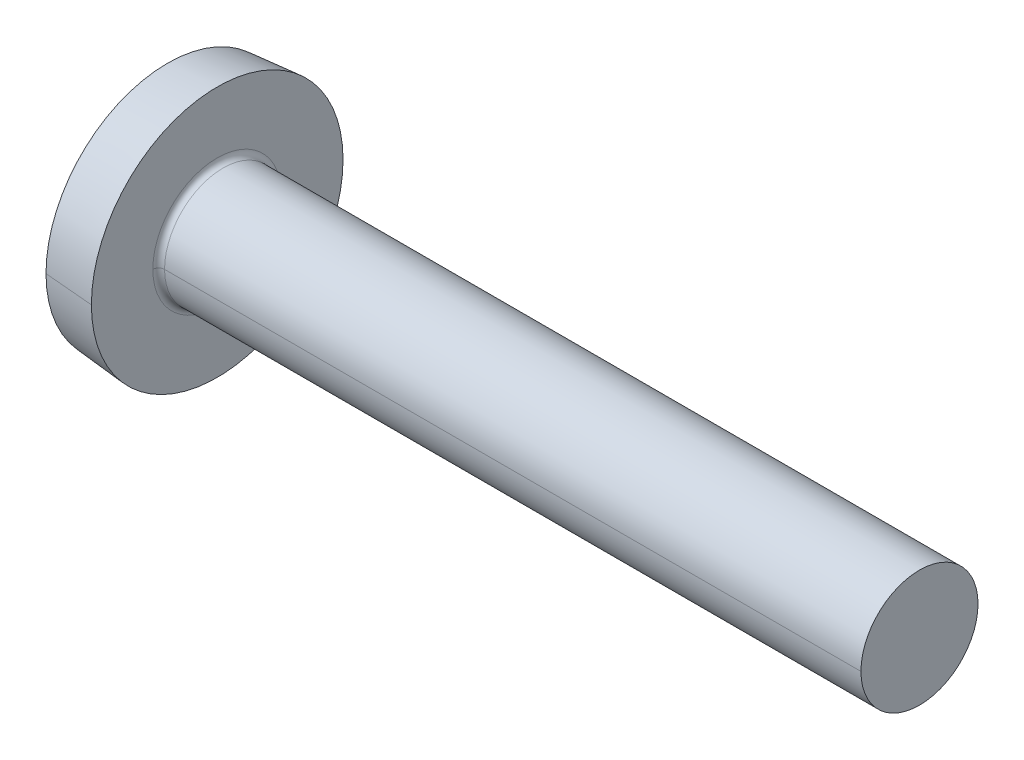
ISO-10303-21;
HEADER;
FILE_DESCRIPTION(('STEP AP214'),'2;1');
FILE_NAME('part.step','',(''),(''),'','','');
FILE_SCHEMA(('AUTOMOTIVE_DESIGN { 1 0 10303 214 1 1 1 1 }'));
ENDSEC;
DATA;
#1=APPLICATION_CONTEXT('core data for automotive mechanical design processes');
#2=APPLICATION_PROTOCOL_DEFINITION('international standard','automotive_design',2000,#1);
#3=PRODUCT_CONTEXT('',#1,'mechanical');
#4=PRODUCT('Part','Part','',(#3));
#5=PRODUCT_RELATED_PRODUCT_CATEGORY('part','',(#4));
#6=PRODUCT_DEFINITION_FORMATION('','',#4);
#7=PRODUCT_DEFINITION_CONTEXT('part definition',#1,'design');
#8=PRODUCT_DEFINITION('design','',#6,#7);
#9=PRODUCT_DEFINITION_SHAPE('','',#8);
#10=(LENGTH_UNIT() NAMED_UNIT(*) SI_UNIT(.MILLI.,.METRE.));
#11=(NAMED_UNIT(*) PLANE_ANGLE_UNIT() SI_UNIT($,.RADIAN.));
#12=(NAMED_UNIT(*) SI_UNIT($,.STERADIAN.) SOLID_ANGLE_UNIT());
#13=UNCERTAINTY_MEASURE_WITH_UNIT(LENGTH_MEASURE(1.E-05),#10,'distance_accuracy_value','');
#14=(GEOMETRIC_REPRESENTATION_CONTEXT(3) GLOBAL_UNCERTAINTY_ASSIGNED_CONTEXT((#13)) GLOBAL_UNIT_ASSIGNED_CONTEXT((#10,
#11,#12)) REPRESENTATION_CONTEXT('',''));
#15=CARTESIAN_POINT('',(0.,0.,0.));
#16=DIRECTION('',(0.,0.,1.));
#17=DIRECTION('',(1.,0.,0.));
#18=AXIS2_PLACEMENT_3D('',#15,#16,#17);
#19=CARTESIAN_POINT('',(-998.839960558206,0.,0.));
#20=DIRECTION('',(-1.,0.,0.));
#21=DIRECTION('',(0.,0.,1.));
#22=AXIS2_PLACEMENT_3D('',#19,#20,#21);
#23=CONICAL_SURFACE('',#22,3077.68353717531,1.25663706143592);
#24=DIRECTION('',(-0.309016994374942,0.,-0.951056516295155));
#25=VECTOR('',#24,1.);
#26=CARTESIAN_POINT('',(1.16003944179423,0.,0.));
#27=LINE('',#26,#25);
#28=CARTESIAN_POINT('',(1.16003944179423,0.,0.));
#29=VERTEX_POINT('',#28);
#30=CARTESIAN_POINT('',(1.01,0.,-0.461773919937062));
#31=VERTEX_POINT('',#30);
#32=EDGE_CURVE('E268',#29,#31,#27,.T.);
#33=ORIENTED_EDGE('',*,*,#32,.F.);
#34=DIRECTION('',(-0.309016994374942,0.,0.951056516295155));
#35=VECTOR('',#34,1.);
#36=CARTESIAN_POINT('',(1.16003944179423,0.,0.));
#37=LINE('',#36,#35);
#38=CARTESIAN_POINT('',(1.01,0.,0.461773919937062));
#39=VERTEX_POINT('',#38);
#40=EDGE_CURVE('E261',#29,#39,#37,.T.);
#41=ORIENTED_EDGE('',*,*,#40,.T.);
#42=CARTESIAN_POINT('',(1.01,0.,0.));
#43=DIRECTION('',(-1.,0.,0.));
#44=DIRECTION('',(0.,0.,1.));
#45=AXIS2_PLACEMENT_3D('',#42,#43,#44);
#46=CIRCLE('',#45,0.461773919937062);
#47=CARTESIAN_POINT('',(1.01,0.242,0.393282536014558));
#48=VERTEX_POINT('',#47);
#49=EDGE_CURVE('E20',#39,#48,#46,.T.);
#50=ORIENTED_EDGE('',*,*,#49,.T.);
#51=CARTESIAN_POINT('',(1.01,0.,0.));
#52=DIRECTION('',(-1.,0.,0.));
#53=DIRECTION('',(0.,0.,1.));
#54=AXIS2_PLACEMENT_3D('',#51,#52,#53);
#55=CIRCLE('',#54,0.461773919937062);
#56=CARTESIAN_POINT('',(1.01,0.393282536014555,0.242));
#57=VERTEX_POINT('',#56);
#58=EDGE_CURVE('E11',#48,#57,#55,.T.);
#59=ORIENTED_EDGE('',*,*,#58,.T.);
#60=CARTESIAN_POINT('',(1.01,0.,0.));
#61=DIRECTION('',(-1.,0.,0.));
#62=DIRECTION('',(0.,0.,1.));
#63=AXIS2_PLACEMENT_3D('',#60,#61,#62);
#64=CIRCLE('',#63,0.461773919937062);
#65=CARTESIAN_POINT('',(1.01,0.393282536014555,-0.242));
#66=VERTEX_POINT('',#65);
#67=EDGE_CURVE('E256',#57,#66,#64,.T.);
#68=ORIENTED_EDGE('',*,*,#67,.T.);
#69=CARTESIAN_POINT('',(1.01,0.,0.));
#70=DIRECTION('',(-1.,0.,0.));
#71=DIRECTION('',(0.,0.,1.));
#72=AXIS2_PLACEMENT_3D('',#69,#70,#71);
#73=CIRCLE('',#72,0.461773919937062);
#74=CARTESIAN_POINT('',(1.01,0.242,-0.393282536014554));
#75=VERTEX_POINT('',#74);
#76=EDGE_CURVE('E27',#66,#75,#73,.T.);
#77=ORIENTED_EDGE('',*,*,#76,.T.);
#78=CARTESIAN_POINT('',(1.01,0.,0.));
#79=DIRECTION('',(-1.,0.,0.));
#80=DIRECTION('',(0.,0.,1.));
#81=AXIS2_PLACEMENT_3D('',#78,#79,#80);
#82=CIRCLE('',#81,0.461773919937062);
#83=EDGE_CURVE('E284',#75,#31,#82,.T.);
#84=ORIENTED_EDGE('',*,*,#83,.T.);
#85=EDGE_LOOP('',(#33,#41,#50,#59,#68,#77,#84));
#86=FACE_BOUND('',#85,.T.);
#87=ADVANCED_FACE('F16',(#86),#23,.F.);
#88=CARTESIAN_POINT('',(1.01,0.,0.));
#89=DIRECTION('',(-1.,0.,0.));
#90=DIRECTION('',(0.,0.,1.));
#91=AXIS2_PLACEMENT_3D('',#88,#89,#90);
#92=CONICAL_SURFACE('',#91,0.461773919937062,0.0698131700797659);
#93=ORIENTED_EDGE('',*,*,#58,.F.);
#94=CARTESIAN_POINT('',(0.0222989292076191,0.242,0.472469952671305));
#95=CARTESIAN_POINT('',(0.351574368229843,0.242,0.446600151504526));
#96=CARTESIAN_POINT('',(0.68081756103972,0.242,0.420309989387921));
#97=CARTESIAN_POINT('',(1.01,0.242,0.393282536014558));
#98=(BOUNDED_CURVE() B_SPLINE_CURVE(3,(#94,#95,#96,#97),.UNSPECIFIED.,.F.,
.F.) B_SPLINE_CURVE_WITH_KNOTS((4,4),(1.33056780263843E-05,0.00100417602866137),
.UNSPECIFIED.) CURVE() GEOMETRIC_REPRESENTATION_ITEM() RATIONAL_B_SPLINE_CURVE((1.,1.,1.,1.)) REPRESENTATION_ITEM(''));
#99=CARTESIAN_POINT('',(0.0222989292076191,0.242,0.472469952671305));
#100=VERTEX_POINT('',#99);
#101=EDGE_CURVE('E99',#100,#48,#98,.T.);
#102=ORIENTED_EDGE('',*,*,#101,.F.);
#103=CARTESIAN_POINT('',(0.0222989292076158,0.,0.));
#104=DIRECTION('',(-1.,0.,0.));
#105=DIRECTION('',(0.,0.,-1.));
#106=AXIS2_PLACEMENT_3D('',#103,#104,#105);
#107=CIRCLE('',#106,0.530840706970757);
#108=CARTESIAN_POINT('',(0.0222989292076154,0.472469952671297,0.242));
#109=VERTEX_POINT('',#108);
#110=EDGE_CURVE('E354',#100,#109,#107,.T.);
#111=ORIENTED_EDGE('',*,*,#110,.T.);
#112=CARTESIAN_POINT('',(1.01,0.393282536014555,0.242));
#113=CARTESIAN_POINT('',(0.723264928197006,0.416824857434073,0.242));
#114=CARTESIAN_POINT('',(0.436483458606667,0.439804254145871,0.242));
#115=CARTESIAN_POINT('',(0.149675395865568,0.46244001007283,0.242));
#116=CARTESIAN_POINT('',(0.107217174076844,0.465790940783483,0.242));
#117=CARTESIAN_POINT('',(0.0647583378043974,0.469134093606567,0.242));
#118=CARTESIAN_POINT('',(0.0222989292076154,0.472469952671297,0.242));
#119=(BOUNDED_CURVE() B_SPLINE_CURVE(3,(#112,#113,#114,#115,#116,#117,#118),.UNSPECIFIED.,.F.,
.F.) B_SPLINE_CURVE_WITH_KNOTS((4,3,4),(2.00672702203388E-07,0.000863300424003911,
0.000991071039363607),
.UNSPECIFIED.) CURVE() GEOMETRIC_REPRESENTATION_ITEM() RATIONAL_B_SPLINE_CURVE((1.,1.,1.,1.,1.,
1.,1.)) REPRESENTATION_ITEM(''));
#120=EDGE_CURVE('E86',#57,#109,#119,.T.);
#121=ORIENTED_EDGE('',*,*,#120,.F.);
#122=EDGE_LOOP('',(#93,#102,#111,#121));
#123=FACE_BOUND('',#122,.T.);
#124=ADVANCED_FACE('F694',(#123),#92,.F.);
#125=CARTESIAN_POINT('',(1.01,0.,0.));
#126=DIRECTION('',(-1.,0.,0.));
#127=DIRECTION('',(0.,0.,1.));
#128=AXIS2_PLACEMENT_3D('',#125,#126,#127);
#129=CONICAL_SURFACE('',#128,0.461773919937062,0.0698131700797659);
#130=CARTESIAN_POINT('',(0.0222989292076158,0.,0.));
#131=DIRECTION('',(-1.,0.,0.));
#132=DIRECTION('',(0.,0.,-1.));
#133=AXIS2_PLACEMENT_3D('',#130,#131,#132);
#134=CIRCLE('',#133,0.530840706970757);
#135=CARTESIAN_POINT('',(0.0222989292076154,-0.472469952671294,0.242));
#136=VERTEX_POINT('',#135);
#137=CARTESIAN_POINT('',(0.0222989292076192,-0.242,0.472469952671304));
#138=VERTEX_POINT('',#137);
#139=EDGE_CURVE('E509',#136,#138,#134,.T.);
#140=ORIENTED_EDGE('',*,*,#139,.T.);
#141=CARTESIAN_POINT('',(1.01,-0.242,0.393282536014554));
#142=CARTESIAN_POINT('',(0.723264928197006,-0.242,0.416824857434072));
#143=CARTESIAN_POINT('',(0.436483458606667,-0.242,0.43980425414587));
#144=CARTESIAN_POINT('',(0.149675395865568,-0.242,0.462440010072829));
#145=CARTESIAN_POINT('',(0.107217174076845,-0.242,0.465790940783483));
#146=CARTESIAN_POINT('',(0.0647583378043983,-0.242,0.469134093606566));
#147=CARTESIAN_POINT('',(0.0222989292076192,-0.242,0.472469952671304));
#148=(BOUNDED_CURVE() B_SPLINE_CURVE(3,(#141,#142,#143,#144,#145,#146,#147),.UNSPECIFIED.,.F.,
.F.) B_SPLINE_CURVE_WITH_KNOTS((4,3,4),(2.00672702203388E-07,0.000863300424003911,
0.000991071039363605),
.UNSPECIFIED.) CURVE() GEOMETRIC_REPRESENTATION_ITEM() RATIONAL_B_SPLINE_CURVE((1.,1.,1.,1.,1.,
1.,1.)) REPRESENTATION_ITEM(''));
#149=CARTESIAN_POINT('',(1.01,-0.242,0.393282536014554));
#150=VERTEX_POINT('',#149);
#151=EDGE_CURVE('E349',#150,#138,#148,.T.);
#152=ORIENTED_EDGE('',*,*,#151,.F.);
#153=CARTESIAN_POINT('',(1.01,0.,0.));
#154=DIRECTION('',(-1.,0.,0.));
#155=DIRECTION('',(0.,0.,1.));
#156=AXIS2_PLACEMENT_3D('',#153,#154,#155);
#157=CIRCLE('',#156,0.461773919937062);
#158=CARTESIAN_POINT('',(1.01,-0.393282536014555,0.242));
#159=VERTEX_POINT('',#158);
#160=EDGE_CURVE('E264',#159,#150,#157,.T.);
#161=ORIENTED_EDGE('',*,*,#160,.F.);
#162=CARTESIAN_POINT('',(0.0222989292076154,-0.472469952671294,0.242));
#163=CARTESIAN_POINT('',(0.351574368229843,-0.446600151504525,0.242));
#164=CARTESIAN_POINT('',(0.68081756103972,-0.42030998938792,0.242));
#165=CARTESIAN_POINT('',(1.01,-0.393282536014555,0.242));
#166=(BOUNDED_CURVE() B_SPLINE_CURVE(3,(#162,#163,#164,#165),.UNSPECIFIED.,.F.,
.F.) B_SPLINE_CURVE_WITH_KNOTS((4,4),(1.33056780263835E-05,0.00100417602866137),
.UNSPECIFIED.) CURVE() GEOMETRIC_REPRESENTATION_ITEM() RATIONAL_B_SPLINE_CURVE((1.,1.,1.,1.)) REPRESENTATION_ITEM(''));
#167=EDGE_CURVE('E369',#136,#159,#166,.T.);
#168=ORIENTED_EDGE('',*,*,#167,.F.);
#169=EDGE_LOOP('',(#140,#152,#161,#168));
#170=FACE_BOUND('',#169,.T.);
#171=ADVANCED_FACE('F688',(#170),#129,.F.);
#172=CARTESIAN_POINT('',(1.01,0.,0.));
#173=DIRECTION('',(-1.,0.,0.));
#174=DIRECTION('',(0.,0.,1.));
#175=AXIS2_PLACEMENT_3D('',#172,#173,#174);
#176=CONICAL_SURFACE('',#175,0.461773919937062,0.0698131700797659);
#177=CARTESIAN_POINT('',(1.01,0.,0.));
#178=DIRECTION('',(-1.,0.,0.));
#179=DIRECTION('',(0.,0.,1.));
#180=AXIS2_PLACEMENT_3D('',#177,#178,#179);
#181=CIRCLE('',#180,0.461773919937062);
#182=CARTESIAN_POINT('',(1.01,-0.242,-0.393282536014555));
#183=VERTEX_POINT('',#182);
#184=CARTESIAN_POINT('',(1.01,-0.393282536014555,-0.242));
#185=VERTEX_POINT('',#184);
#186=EDGE_CURVE('E413',#183,#185,#181,.T.);
#187=ORIENTED_EDGE('',*,*,#186,.F.);
#188=CARTESIAN_POINT('',(0.0222989292076187,-0.242,-0.472469952671306));
#189=CARTESIAN_POINT('',(0.351574368229843,-0.242,-0.446600151504526));
#190=CARTESIAN_POINT('',(0.68081756103972,-0.242,-0.420309989387921));
#191=CARTESIAN_POINT('',(1.01,-0.242,-0.393282536014555));
#192=(BOUNDED_CURVE() B_SPLINE_CURVE(3,(#188,#189,#190,#191),.UNSPECIFIED.,.F.,
.F.) B_SPLINE_CURVE_WITH_KNOTS((4,4),(1.33056780263838E-05,0.00100417602866137),
.UNSPECIFIED.) CURVE() GEOMETRIC_REPRESENTATION_ITEM() RATIONAL_B_SPLINE_CURVE((1.,1.,1.,1.)) REPRESENTATION_ITEM(''));
#193=CARTESIAN_POINT('',(0.0222989292076187,-0.242,-0.472469952671306));
#194=VERTEX_POINT('',#193);
#195=EDGE_CURVE('E314',#194,#183,#192,.T.);
#196=ORIENTED_EDGE('',*,*,#195,.F.);
#197=CARTESIAN_POINT('',(0.0222989292076158,0.,0.));
#198=DIRECTION('',(-1.,0.,0.));
#199=DIRECTION('',(0.,0.,-1.));
#200=AXIS2_PLACEMENT_3D('',#197,#198,#199);
#201=CIRCLE('',#200,0.530840706970757);
#202=CARTESIAN_POINT('',(0.0222989292076154,-0.472469952671294,-0.242));
#203=VERTEX_POINT('',#202);
#204=EDGE_CURVE('E400',#194,#203,#201,.T.);
#205=ORIENTED_EDGE('',*,*,#204,.T.);
#206=CARTESIAN_POINT('',(1.01,-0.393282536014555,-0.242));
#207=CARTESIAN_POINT('',(0.723264928197006,-0.416824857434073,-0.242));
#208=CARTESIAN_POINT('',(0.436483458606667,-0.439804254145871,-0.242));
#209=CARTESIAN_POINT('',(0.149675395865568,-0.46244001007283,-0.242));
#210=CARTESIAN_POINT('',(0.107217174076844,-0.465790940783483,-0.242));
#211=CARTESIAN_POINT('',(0.0647583378043975,-0.469134093606567,-0.242));
#212=CARTESIAN_POINT('',(0.0222989292076154,-0.472469952671294,-0.242));
#213=(BOUNDED_CURVE() B_SPLINE_CURVE(3,(#206,#207,#208,#209,#210,#211,#212),.UNSPECIFIED.,.F.,
.F.) B_SPLINE_CURVE_WITH_KNOTS((4,3,4),(2.00672702203379E-07,0.000863300424003911,
0.000991071039363607),
.UNSPECIFIED.) CURVE() GEOMETRIC_REPRESENTATION_ITEM() RATIONAL_B_SPLINE_CURVE((1.,1.,1.,1.,1.,
1.,1.)) REPRESENTATION_ITEM(''));
#214=EDGE_CURVE('E421',#185,#203,#213,.T.);
#215=ORIENTED_EDGE('',*,*,#214,.F.);
#216=EDGE_LOOP('',(#187,#196,#205,#215));
#217=FACE_BOUND('',#216,.T.);
#218=ADVANCED_FACE('F693',(#217),#176,.F.);
#219=CARTESIAN_POINT('',(1.01,0.,0.));
#220=DIRECTION('',(-1.,0.,0.));
#221=DIRECTION('',(0.,0.,1.));
#222=AXIS2_PLACEMENT_3D('',#219,#220,#221);
#223=CONICAL_SURFACE('',#222,0.461773919937062,0.0698131700797659);
#224=CARTESIAN_POINT('',(0.0222989292076158,0.,0.));
#225=DIRECTION('',(-1.,0.,0.));
#226=DIRECTION('',(0.,0.,-1.));
#227=AXIS2_PLACEMENT_3D('',#224,#225,#226);
#228=CIRCLE('',#227,0.530840706970757);
#229=CARTESIAN_POINT('',(0.0222989292076154,0.472469952671297,-0.242));
#230=VERTEX_POINT('',#229);
#231=CARTESIAN_POINT('',(0.0222989292076188,0.242,-0.472469952671304));
#232=VERTEX_POINT('',#231);
#233=EDGE_CURVE('E439',#230,#232,#228,.T.);
#234=ORIENTED_EDGE('',*,*,#233,.T.);
#235=CARTESIAN_POINT('',(1.01,0.242,-0.393282536014554));
#236=CARTESIAN_POINT('',(0.723264928197006,0.242,-0.416824857434072));
#237=CARTESIAN_POINT('',(0.436483458606667,0.242,-0.43980425414587));
#238=CARTESIAN_POINT('',(0.149675395865568,0.242,-0.462440010072829));
#239=CARTESIAN_POINT('',(0.107217174076844,0.242,-0.465790940783482));
#240=CARTESIAN_POINT('',(0.0647583378043979,0.242,-0.469134093606566));
#241=CARTESIAN_POINT('',(0.0222989292076188,0.242,-0.472469952671304));
#242=(BOUNDED_CURVE() B_SPLINE_CURVE(3,(#235,#236,#237,#238,#239,#240,#241),.UNSPECIFIED.,.F.,
.F.) B_SPLINE_CURVE_WITH_KNOTS((4,3,4),(2.00672702203379E-07,0.00086330042400391,
0.000991071039363606),
.UNSPECIFIED.) CURVE() GEOMETRIC_REPRESENTATION_ITEM() RATIONAL_B_SPLINE_CURVE((1.,1.,1.,1.,1.,
1.,1.)) REPRESENTATION_ITEM(''));
#243=EDGE_CURVE('E531',#75,#232,#242,.T.);
#244=ORIENTED_EDGE('',*,*,#243,.F.);
#245=ORIENTED_EDGE('',*,*,#76,.F.);
#246=CARTESIAN_POINT('',(0.0222989292076154,0.472469952671297,-0.242));
#247=CARTESIAN_POINT('',(0.351574368229842,0.446600151504525,-0.242));
#248=CARTESIAN_POINT('',(0.68081756103972,0.42030998938792,-0.242));
#249=CARTESIAN_POINT('',(1.01,0.393282536014555,-0.242));
#250=(BOUNDED_CURVE() B_SPLINE_CURVE(3,(#246,#247,#248,#249),.UNSPECIFIED.,.F.,
.F.) B_SPLINE_CURVE_WITH_KNOTS((4,4),(1.33056780263826E-05,0.00100417602866137),
.UNSPECIFIED.) CURVE() GEOMETRIC_REPRESENTATION_ITEM() RATIONAL_B_SPLINE_CURVE((1.,1.,1.,1.)) REPRESENTATION_ITEM(''));
#251=EDGE_CURVE('E346',#230,#66,#250,.T.);
#252=ORIENTED_EDGE('',*,*,#251,.F.);
#253=EDGE_LOOP('',(#234,#244,#245,#252));
#254=FACE_BOUND('',#253,.T.);
#255=ADVANCED_FACE('F756',(#254),#223,.F.);
#256=CARTESIAN_POINT('',(1.01,-0.242,0.596432660078354));
#257=DIRECTION('',(-0.446197753347436,0.,-0.894934391398443));
#258=DIRECTION('',(-0.894934391398443,0.,0.446197753347436));
#259=AXIS2_PLACEMENT_3D('',#256,#257,#258);
#260=PLANE('',#259);
#261=CARTESIAN_POINT('',(5.50871879382181,0.,-1.64654541522893));
#262=DIRECTION('',(-0.446197753347436,0.,-0.894934391398442));
#263=DIRECTION('',(-0.894934391398442,0.,0.446197753347436));
#264=AXIS2_PLACEMENT_3D('',#261,#262,#263);
#265=CIRCLE('',#264,6.0563598363473);
#266=CARTESIAN_POINT('',(0.0930027520378574,-0.242000000000004,1.05363054609));
#267=VERTEX_POINT('',#266);
#268=CARTESIAN_POINT('',(0.0930027520378574,0.241999999999996,1.05363054609));
#269=VERTEX_POINT('',#268);
#270=EDGE_CURVE('E381',#267,#269,#265,.T.);
#271=ORIENTED_EDGE('',*,*,#270,.T.);
#272=DIRECTION('',(0.894934391398443,0.,-0.446197753347436));
#273=VECTOR('',#272,1.);
#274=CARTESIAN_POINT('',(0.,0.241999999999996,1.1));
#275=LINE('',#274,#273);
#276=CARTESIAN_POINT('',(1.01,0.241999999999997,0.596432660078355));
#277=VERTEX_POINT('',#276);
#278=EDGE_CURVE('E371',#269,#277,#275,.T.);
#279=ORIENTED_EDGE('',*,*,#278,.T.);
#280=DIRECTION('',(0.,-1.,0.));
#281=VECTOR('',#280,1.);
#282=CARTESIAN_POINT('',(1.01,-0.242,0.596432660078354));
#283=LINE('',#282,#281);
#284=CARTESIAN_POINT('',(1.01,-0.242,0.596432660078354));
#285=VERTEX_POINT('',#284);
#286=EDGE_CURVE('E384',#277,#285,#283,.T.);
#287=ORIENTED_EDGE('',*,*,#286,.T.);
#288=DIRECTION('',(0.894934391398443,0.,-0.446197753347436));
#289=VECTOR('',#288,1.);
#290=CARTESIAN_POINT('',(0.,-0.242000000000004,1.1));
#291=LINE('',#290,#289);
#292=EDGE_CURVE('E453',#267,#285,#291,.T.);
#293=ORIENTED_EDGE('',*,*,#292,.F.);
#294=EDGE_LOOP('',(#271,#279,#287,#293));
#295=FACE_BOUND('',#294,.T.);
#296=ADVANCED_FACE('F745',(#295),#260,.T.);
#297=CARTESIAN_POINT('',(0.,0.242000000000004,-1.1));
#298=DIRECTION('',(-0.446197753347436,0.,0.894934391398443));
#299=DIRECTION('',(0.,1.,0.));
#300=AXIS2_PLACEMENT_3D('',#297,#298,#299);
#301=PLANE('',#300);
#302=CARTESIAN_POINT('',(5.50871879382181,0.,1.64654541522893));
#303=DIRECTION('',(-0.446197753347436,0.,0.894934391398443));
#304=DIRECTION('',(0.894934391398443,0.,0.446197753347436));
#305=AXIS2_PLACEMENT_3D('',#302,#303,#304);
#306=CIRCLE('',#305,6.0563598363473);
#307=CARTESIAN_POINT('',(0.0930027520378574,0.242000000000003,-1.05363054609));
#308=VERTEX_POINT('',#307);
#309=CARTESIAN_POINT('',(0.0930027520378574,-0.241999999999996,-1.05363054609));
#310=VERTEX_POINT('',#309);
#311=EDGE_CURVE('E469',#308,#310,#306,.T.);
#312=ORIENTED_EDGE('',*,*,#311,.T.);
#313=DIRECTION('',(0.894934391398442,0.,0.446197753347436));
#314=VECTOR('',#313,1.);
#315=CARTESIAN_POINT('',(0.,-0.241999999999996,-1.1));
#316=LINE('',#315,#314);
#317=CARTESIAN_POINT('',(1.01,-0.242,-0.596432660078356));
#318=VERTEX_POINT('',#317);
#319=EDGE_CURVE('E42',#310,#318,#316,.T.);
#320=ORIENTED_EDGE('',*,*,#319,.T.);
#321=DIRECTION('',(0.,1.,0.));
#322=VECTOR('',#321,1.);
#323=CARTESIAN_POINT('',(1.01,-0.242,-0.596432660078356));
#324=LINE('',#323,#322);
#325=CARTESIAN_POINT('',(1.01,0.242,-0.596432660078354));
#326=VERTEX_POINT('',#325);
#327=EDGE_CURVE('E378',#318,#326,#324,.T.);
#328=ORIENTED_EDGE('',*,*,#327,.T.);
#329=DIRECTION('',(0.894934391398443,0.,0.446197753347436));
#330=VECTOR('',#329,1.);
#331=CARTESIAN_POINT('',(0.,0.242000000000004,-1.1));
#332=LINE('',#331,#330);
#333=EDGE_CURVE('E544',#308,#326,#332,.T.);
#334=ORIENTED_EDGE('',*,*,#333,.F.);
#335=EDGE_LOOP('',(#312,#320,#328,#334));
#336=FACE_BOUND('',#335,.T.);
#337=ADVANCED_FACE('F739',(#336),#301,.T.);
#338=CARTESIAN_POINT('',(1.01,0.596432660078354,0.242));
#339=DIRECTION('',(-0.446197753347436,-0.894934391398443,0.));
#340=DIRECTION('',(-0.894934391398443,0.446197753347436,0.));
#341=AXIS2_PLACEMENT_3D('',#338,#339,#340);
#342=PLANE('',#341);
#343=CARTESIAN_POINT('',(5.50871879382181,-1.64654541522893,0.));
#344=DIRECTION('',(-0.446197753347436,-0.894934391398443,0.));
#345=DIRECTION('',(0.894934391398443,-0.446197753347436,0.));
#346=AXIS2_PLACEMENT_3D('',#343,#344,#345);
#347=CIRCLE('',#346,6.0563598363473);
#348=CARTESIAN_POINT('',(0.0930027520378574,1.05363054609,0.242));
#349=VERTEX_POINT('',#348);
#350=CARTESIAN_POINT('',(0.0886740895903685,1.05578873721287,0.));
#351=VERTEX_POINT('',#350);
#352=EDGE_CURVE('E292',#349,#351,#347,.T.);
#353=ORIENTED_EDGE('',*,*,#352,.T.);
#354=CARTESIAN_POINT('',(5.50871879382181,-1.64654541522893,0.));
#355=DIRECTION('',(-0.446197753347436,-0.894934391398443,0.));
#356=DIRECTION('',(0.894934391398443,-0.446197753347436,0.));
#357=AXIS2_PLACEMENT_3D('',#354,#355,#356);
#358=CIRCLE('',#357,6.0563598363473);
#359=CARTESIAN_POINT('',(0.0930027520378574,1.05363054609,-0.242));
#360=VERTEX_POINT('',#359);
#361=EDGE_CURVE('E330',#351,#360,#358,.T.);
#362=ORIENTED_EDGE('',*,*,#361,.T.);
#363=DIRECTION('',(0.894934391398443,-0.446197753347436,0.));
#364=VECTOR('',#363,1.);
#365=CARTESIAN_POINT('',(0.,1.1,-0.242));
#366=LINE('',#365,#364);
#367=CARTESIAN_POINT('',(1.01,0.596432660078354,-0.242));
#368=VERTEX_POINT('',#367);
#369=EDGE_CURVE('E345',#360,#368,#366,.T.);
#370=ORIENTED_EDGE('',*,*,#369,.T.);
#371=DIRECTION('',(0.,0.,1.));
#372=VECTOR('',#371,1.);
#373=CARTESIAN_POINT('',(1.01,0.596432660078354,0.242));
#374=LINE('',#373,#372);
#375=CARTESIAN_POINT('',(1.01,0.596432660078354,0.242));
#376=VERTEX_POINT('',#375);
#377=EDGE_CURVE('E281',#368,#376,#374,.T.);
#378=ORIENTED_EDGE('',*,*,#377,.T.);
#379=DIRECTION('',(0.894934391398443,-0.446197753347436,0.));
#380=VECTOR('',#379,1.);
#381=CARTESIAN_POINT('',(0.,1.1,0.242));
#382=LINE('',#381,#380);
#383=EDGE_CURVE('E481',#349,#376,#382,.T.);
#384=ORIENTED_EDGE('',*,*,#383,.F.);
#385=EDGE_LOOP('',(#353,#362,#370,#378,#384));
#386=FACE_BOUND('',#385,.T.);
#387=ADVANCED_FACE('F744',(#386),#342,.T.);
#388=CARTESIAN_POINT('',(0.,-1.1,-0.242));
#389=DIRECTION('',(-0.446197753347436,0.894934391398443,0.));
#390=DIRECTION('',(0.,0.,1.));
#391=AXIS2_PLACEMENT_3D('',#388,#389,#390);
#392=PLANE('',#391);
#393=CARTESIAN_POINT('',(5.50871879382181,1.64654541522893,0.));
#394=DIRECTION('',(-0.446197753347436,0.894934391398442,0.));
#395=DIRECTION('',(-0.894934391398443,-0.446197753347436,0.));
#396=AXIS2_PLACEMENT_3D('',#393,#394,#395);
#397=CIRCLE('',#396,6.0563598363473);
#398=CARTESIAN_POINT('',(0.0930027520378582,-1.05363054609,-0.242));
#399=VERTEX_POINT('',#398);
#400=CARTESIAN_POINT('',(0.0886740895903685,-1.05578873721288,0.));
#401=VERTEX_POINT('',#400);
#402=EDGE_CURVE('E362',#399,#401,#397,.T.);
#403=ORIENTED_EDGE('',*,*,#402,.T.);
#404=CARTESIAN_POINT('',(5.50871879382181,1.64654541522893,0.));
#405=DIRECTION('',(-0.446197753347436,0.894934391398442,0.));
#406=DIRECTION('',(-0.894934391398443,-0.446197753347436,0.));
#407=AXIS2_PLACEMENT_3D('',#404,#405,#406);
#408=CIRCLE('',#407,6.0563598363473);
#409=CARTESIAN_POINT('',(0.0930027520378574,-1.05363054609,0.242));
#410=VERTEX_POINT('',#409);
#411=EDGE_CURVE('E365',#401,#410,#408,.T.);
#412=ORIENTED_EDGE('',*,*,#411,.T.);
#413=DIRECTION('',(0.894934391398442,0.446197753347436,0.));
#414=VECTOR('',#413,1.);
#415=CARTESIAN_POINT('',(0.,-1.1,0.242));
#416=LINE('',#415,#414);
#417=CARTESIAN_POINT('',(1.01,-0.596432660078355,0.242));
#418=VERTEX_POINT('',#417);
#419=EDGE_CURVE('E448',#410,#418,#416,.T.);
#420=ORIENTED_EDGE('',*,*,#419,.T.);
#421=DIRECTION('',(0.,0.,-1.));
#422=VECTOR('',#421,1.);
#423=CARTESIAN_POINT('',(1.01,-0.596432660078355,0.242));
#424=LINE('',#423,#422);
#425=CARTESIAN_POINT('',(1.01,-0.596432660078355,-0.242));
#426=VERTEX_POINT('',#425);
#427=EDGE_CURVE('E503',#418,#426,#424,.T.);
#428=ORIENTED_EDGE('',*,*,#427,.T.);
#429=DIRECTION('',(0.894934391398443,0.446197753347436,0.));
#430=VECTOR('',#429,1.);
#431=CARTESIAN_POINT('',(0.,-1.1,-0.242));
#432=LINE('',#431,#430);
#433=EDGE_CURVE('E426',#399,#426,#432,.T.);
#434=ORIENTED_EDGE('',*,*,#433,.F.);
#435=EDGE_LOOP('',(#403,#412,#420,#428,#434));
#436=FACE_BOUND('',#435,.T.);
#437=ADVANCED_FACE('F898',(#436),#392,.T.);
#438=CARTESIAN_POINT('',(1.3,0.,0.));
#439=DIRECTION('',(-1.,0.,0.));
#440=DIRECTION('',(0.,0.,1.));
#441=AXIS2_PLACEMENT_3D('',#438,#439,#440);
#442=TOROIDAL_SURFACE('',#441,1.1,0.1);
#443=CARTESIAN_POINT('',(1.3,0.,-1.1));
#444=DIRECTION('',(0.,1.,0.));
#445=DIRECTION('',(0.,0.,1.));
#446=AXIS2_PLACEMENT_3D('',#443,#444,#445);
#447=CIRCLE('',#446,0.1);
#448=CARTESIAN_POINT('',(1.2,0.,-1.1));
#449=VERTEX_POINT('',#448);
#450=CARTESIAN_POINT('',(1.3,0.,-1.));
#451=VERTEX_POINT('',#450);
#452=EDGE_CURVE('E318',#449,#451,#447,.T.);
#453=ORIENTED_EDGE('',*,*,#452,.F.);
#454=CARTESIAN_POINT('',(1.2,0.,0.));
#455=DIRECTION('',(-1.,0.,0.));
#456=DIRECTION('',(0.,0.,1.));
#457=AXIS2_PLACEMENT_3D('',#454,#455,#456);
#458=CIRCLE('',#457,1.1);
#459=CARTESIAN_POINT('',(1.2,0.,1.1));
#460=VERTEX_POINT('',#459);
#461=EDGE_CURVE('E302',#460,#449,#458,.T.);
#462=ORIENTED_EDGE('',*,*,#461,.F.);
#463=CARTESIAN_POINT('',(1.3,0.,1.1));
#464=DIRECTION('',(0.,-1.,0.));
#465=DIRECTION('',(0.,0.,-1.));
#466=AXIS2_PLACEMENT_3D('',#463,#464,#465);
#467=CIRCLE('',#466,0.1);
#468=CARTESIAN_POINT('',(1.3,0.,1.));
#469=VERTEX_POINT('',#468);
#470=EDGE_CURVE('E409',#460,#469,#467,.T.);
#471=ORIENTED_EDGE('',*,*,#470,.T.);
#472=CARTESIAN_POINT('',(1.3,0.,0.));
#473=DIRECTION('',(1.,0.,0.));
#474=DIRECTION('',(0.,0.,1.));
#475=AXIS2_PLACEMENT_3D('',#472,#473,#474);
#476=CIRCLE('',#475,1.);
#477=EDGE_CURVE('E289',#451,#469,#476,.T.);
#478=ORIENTED_EDGE('',*,*,#477,.F.);
#479=EDGE_LOOP('',(#453,#462,#471,#478));
#480=FACE_BOUND('',#479,.T.);
#481=ADVANCED_FACE('F817',(#480),#442,.F.);
#482=CARTESIAN_POINT('',(13.2,1.,0.));
#483=DIRECTION('',(-1.,0.,0.));
#484=DIRECTION('',(0.,0.,1.));
#485=AXIS2_PLACEMENT_3D('',#482,#483,#484);
#486=PLANE('',#485);
#487=CARTESIAN_POINT('',(13.2,0.,0.));
#488=DIRECTION('',(-1.,0.,0.));
#489=DIRECTION('',(0.,0.,1.));
#490=AXIS2_PLACEMENT_3D('',#487,#488,#489);
#491=CIRCLE('',#490,1.);
#492=CARTESIAN_POINT('',(13.2,0.,1.));
#493=VERTEX_POINT('',#492);
#494=CARTESIAN_POINT('',(13.2,0.,-1.));
#495=VERTEX_POINT('',#494);
#496=EDGE_CURVE('E334',#493,#495,#491,.T.);
#497=ORIENTED_EDGE('',*,*,#496,.F.);
#498=CARTESIAN_POINT('',(13.2,0.,0.));
#499=DIRECTION('',(-1.,0.,0.));
#500=DIRECTION('',(0.,0.,1.));
#501=AXIS2_PLACEMENT_3D('',#498,#499,#500);
#502=CIRCLE('',#501,1.);
#503=EDGE_CURVE('E296',#495,#493,#502,.T.);
#504=ORIENTED_EDGE('',*,*,#503,.F.);
#505=EDGE_LOOP('',(#497,#504));
#506=FACE_BOUND('',#505,.T.);
#507=ADVANCED_FACE('F811',(#506),#486,.F.);
#508=CARTESIAN_POINT('',(0.,0.,0.));
#509=DIRECTION('',(-1.,0.,0.));
#510=DIRECTION('',(0.,0.,1.));
#511=AXIS2_PLACEMENT_3D('',#508,#509,#510);
#512=CYLINDRICAL_SURFACE('',#511,1.);
#513=DIRECTION('',(-1.,0.,0.));
#514=VECTOR('',#513,1.);
#515=CARTESIAN_POINT('',(0.,0.,-1.));
#516=LINE('',#515,#514);
#517=EDGE_CURVE('E326',#495,#451,#516,.T.);
#518=ORIENTED_EDGE('',*,*,#517,.F.);
#519=ORIENTED_EDGE('',*,*,#503,.T.);
#520=DIRECTION('',(-1.,0.,0.));
#521=VECTOR('',#520,1.);
#522=CARTESIAN_POINT('',(0.,0.,1.));
#523=LINE('',#522,#521);
#524=EDGE_CURVE('E285',#493,#469,#523,.T.);
#525=ORIENTED_EDGE('',*,*,#524,.T.);
#526=CARTESIAN_POINT('',(1.3,0.,0.));
#527=DIRECTION('',(1.,0.,0.));
#528=DIRECTION('',(0.,0.,1.));
#529=AXIS2_PLACEMENT_3D('',#526,#527,#528);
#530=CIRCLE('',#529,1.);
#531=EDGE_CURVE('E322',#469,#451,#530,.T.);
#532=ORIENTED_EDGE('',*,*,#531,.T.);
#533=EDGE_LOOP('',(#518,#519,#525,#532));
#534=FACE_BOUND('',#533,.T.);
#535=ADVANCED_FACE('F816',(#534),#512,.T.);
#536=CARTESIAN_POINT('',(1.2,1.,0.));
#537=DIRECTION('',(-1.,0.,0.));
#538=DIRECTION('',(0.,0.,1.));
#539=AXIS2_PLACEMENT_3D('',#536,#537,#538);
#540=PLANE('',#539);
#541=ORIENTED_EDGE('',*,*,#461,.T.);
#542=CARTESIAN_POINT('',(1.2,0.,0.));
#543=DIRECTION('',(-1.,0.,0.));
#544=DIRECTION('',(0.,0.,1.));
#545=AXIS2_PLACEMENT_3D('',#542,#543,#544);
#546=CIRCLE('',#545,1.1);
#547=EDGE_CURVE('E266',#449,#460,#546,.T.);
#548=ORIENTED_EDGE('',*,*,#547,.T.);
#549=EDGE_LOOP('',(#541,#548));
#550=FACE_BOUND('',#549,.T.);
#551=CARTESIAN_POINT('',(1.2,0.,0.));
#552=DIRECTION('',(-1.,0.,0.));
#553=DIRECTION('',(0.,0.,1.));
#554=AXIS2_PLACEMENT_3D('',#551,#552,#553);
#555=CIRCLE('',#554,2.15);
#556=CARTESIAN_POINT('',(1.2,0.,-2.15));
#557=VERTEX_POINT('',#556);
#558=CARTESIAN_POINT('',(1.2,0.,2.15));
#559=VERTEX_POINT('',#558);
#560=EDGE_CURVE('E310',#557,#559,#555,.T.);
#561=ORIENTED_EDGE('',*,*,#560,.F.);
#562=CARTESIAN_POINT('',(1.2,0.,0.));
#563=DIRECTION('',(-1.,0.,0.));
#564=DIRECTION('',(0.,0.,1.));
#565=AXIS2_PLACEMENT_3D('',#562,#563,#564);
#566=CIRCLE('',#565,2.15);
#567=EDGE_CURVE('E420',#559,#557,#566,.T.);
#568=ORIENTED_EDGE('',*,*,#567,.F.);
#569=EDGE_LOOP('',(#561,#568));
#570=FACE_BOUND('',#569,.T.);
#571=ADVANCED_FACE('F706',(#550,#570),#540,.F.);
#572=CARTESIAN_POINT('',(1.2,0.,0.));
#573=DIRECTION('',(1.,0.,0.));
#574=DIRECTION('',(0.,0.,-1.));
#575=AXIS2_PLACEMENT_3D('',#572,#573,#574);
#576=CONICAL_SURFACE('',#575,2.15,0.08726646259971);
#577=DIRECTION('',(0.996194698091746,0.,0.0871557427476522));
#578=VECTOR('',#577,1.);
#579=CARTESIAN_POINT('',(1.2,0.,2.15));
#580=LINE('',#579,#578);
#581=CARTESIAN_POINT('',(0.35,0.,2.07563463600297));
#582=VERTEX_POINT('',#581);
#583=EDGE_CURVE('E416',#582,#559,#580,.T.);
#584=ORIENTED_EDGE('',*,*,#583,.F.);
#585=CARTESIAN_POINT('',(0.35,0.,0.));
#586=DIRECTION('',(-1.,0.,0.));
#587=DIRECTION('',(0.,0.,1.));
#588=AXIS2_PLACEMENT_3D('',#585,#586,#587);
#589=CIRCLE('',#588,2.07563463600297);
#590=CARTESIAN_POINT('',(0.35,-2.07563463600297,0.));
#591=VERTEX_POINT('',#590);
#592=EDGE_CURVE('E290',#591,#582,#589,.T.);
#593=ORIENTED_EDGE('',*,*,#592,.F.);
#594=CARTESIAN_POINT('',(0.35,0.,0.));
#595=DIRECTION('',(-1.,0.,0.));
#596=DIRECTION('',(0.,0.,1.));
#597=AXIS2_PLACEMENT_3D('',#594,#595,#596);
#598=CIRCLE('',#597,2.07563463600297);
#599=CARTESIAN_POINT('',(0.35,0.,-2.07563463600297));
#600=VERTEX_POINT('',#599);
#601=EDGE_CURVE('E339',#600,#591,#598,.T.);
#602=ORIENTED_EDGE('',*,*,#601,.F.);
#603=DIRECTION('',(0.996194698091746,0.,-0.0871557427476522));
#604=VECTOR('',#603,1.);
#605=CARTESIAN_POINT('',(1.2,0.,-2.15));
#606=LINE('',#605,#604);
#607=EDGE_CURVE('E340',#600,#557,#606,.T.);
#608=ORIENTED_EDGE('',*,*,#607,.T.);
#609=ORIENTED_EDGE('',*,*,#560,.T.);
#610=EDGE_LOOP('',(#584,#593,#602,#608,#609));
#611=FACE_BOUND('',#610,.T.);
#612=ADVANCED_FACE('F679',(#611),#576,.T.);
#613=CARTESIAN_POINT('',(1.01,0.241999999999997,0.596432660078355));
#614=DIRECTION('',(0.,-1.,0.));
#615=DIRECTION('',(0.,0.,-1.));
#616=AXIS2_PLACEMENT_3D('',#613,#614,#615);
#617=PLANE('',#616);
#618=CARTESIAN_POINT('',(6.32965591739311,0.242,0.));
#619=DIRECTION('',(0.,-1.,0.));
#620=DIRECTION('',(0.,0.,-1.));
#621=AXIS2_PLACEMENT_3D('',#618,#619,#620);
#622=CIRCLE('',#621,6.32502806575509);
#623=EDGE_CURVE('E357',#269,#100,#622,.T.);
#624=ORIENTED_EDGE('',*,*,#623,.T.);
#625=ORIENTED_EDGE('',*,*,#101,.T.);
#626=DIRECTION('',(0.,0.,1.));
#627=VECTOR('',#626,1.);
#628=CARTESIAN_POINT('',(1.01,0.241999999999997,0.596432660078355));
#629=LINE('',#628,#627);
#630=EDGE_CURVE('E252',#48,#277,#629,.T.);
#631=ORIENTED_EDGE('',*,*,#630,.T.);
#632=ORIENTED_EDGE('',*,*,#278,.F.);
#633=EDGE_LOOP('',(#624,#625,#631,#632));
#634=FACE_BOUND('',#633,.T.);
#635=ADVANCED_FACE('F673',(#634),#617,.T.);
#636=CARTESIAN_POINT('',(1.01,-0.242,-0.596432660078356));
#637=DIRECTION('',(0.,1.,0.));
#638=DIRECTION('',(0.,0.,-1.));
#639=AXIS2_PLACEMENT_3D('',#636,#637,#638);
#640=PLANE('',#639);
#641=DIRECTION('',(0.,0.,-1.));
#642=VECTOR('',#641,1.);
#643=CARTESIAN_POINT('',(1.01,-0.242,0.596432660078354));
#644=LINE('',#643,#642);
#645=EDGE_CURVE('E279',#285,#150,#644,.T.);
#646=ORIENTED_EDGE('',*,*,#645,.T.);
#647=ORIENTED_EDGE('',*,*,#151,.T.);
#648=CARTESIAN_POINT('',(6.32965591739311,-0.242,0.));
#649=DIRECTION('',(0.,1.,0.));
#650=DIRECTION('',(0.,0.,1.));
#651=AXIS2_PLACEMENT_3D('',#648,#649,#650);
#652=CIRCLE('',#651,6.32502806575509);
#653=EDGE_CURVE('E405',#138,#267,#652,.T.);
#654=ORIENTED_EDGE('',*,*,#653,.T.);
#655=ORIENTED_EDGE('',*,*,#292,.T.);
#656=EDGE_LOOP('',(#646,#647,#654,#655));
#657=FACE_BOUND('',#656,.T.);
#658=ADVANCED_FACE('F678',(#657),#640,.T.);
#659=CARTESIAN_POINT('',(1.01,-0.242,-0.596432660078356));
#660=DIRECTION('',(0.,1.,0.));
#661=DIRECTION('',(0.,0.,-1.));
#662=AXIS2_PLACEMENT_3D('',#659,#660,#661);
#663=PLANE('',#662);
#664=CARTESIAN_POINT('',(6.32965591739311,-0.242,0.));
#665=DIRECTION('',(0.,1.,0.));
#666=DIRECTION('',(0.,0.,1.));
#667=AXIS2_PLACEMENT_3D('',#664,#665,#666);
#668=CIRCLE('',#667,6.32502806575509);
#669=EDGE_CURVE('E465',#310,#194,#668,.T.);
#670=ORIENTED_EDGE('',*,*,#669,.T.);
#671=ORIENTED_EDGE('',*,*,#195,.T.);
#672=DIRECTION('',(0.,0.,-1.));
#673=VECTOR('',#672,1.);
#674=CARTESIAN_POINT('',(1.01,-0.242,0.596432660078354));
#675=LINE('',#674,#673);
#676=EDGE_CURVE('E515',#183,#318,#675,.T.);
#677=ORIENTED_EDGE('',*,*,#676,.T.);
#678=ORIENTED_EDGE('',*,*,#319,.F.);
#679=EDGE_LOOP('',(#670,#671,#677,#678));
#680=FACE_BOUND('',#679,.T.);
#681=ADVANCED_FACE('F717',(#680),#663,.T.);
#682=CARTESIAN_POINT('',(1.01,0.241999999999997,0.596432660078355));
#683=DIRECTION('',(0.,-1.,0.));
#684=DIRECTION('',(0.,0.,-1.));
#685=AXIS2_PLACEMENT_3D('',#682,#683,#684);
#686=PLANE('',#685);
#687=DIRECTION('',(0.,0.,1.));
#688=VECTOR('',#687,1.);
#689=CARTESIAN_POINT('',(1.01,0.241999999999997,0.596432660078355));
#690=LINE('',#689,#688);
#691=EDGE_CURVE('E374',#326,#75,#690,.T.);
#692=ORIENTED_EDGE('',*,*,#691,.T.);
#693=ORIENTED_EDGE('',*,*,#243,.T.);
#694=CARTESIAN_POINT('',(6.32965591739311,0.242,0.));
#695=DIRECTION('',(0.,-1.,0.));
#696=DIRECTION('',(0.,0.,-1.));
#697=AXIS2_PLACEMENT_3D('',#694,#695,#696);
#698=CIRCLE('',#697,6.32502806575509);
#699=EDGE_CURVE('E447',#232,#308,#698,.T.);
#700=ORIENTED_EDGE('',*,*,#699,.T.);
#701=ORIENTED_EDGE('',*,*,#333,.T.);
#702=EDGE_LOOP('',(#692,#693,#700,#701));
#703=FACE_BOUND('',#702,.T.);
#704=ADVANCED_FACE('F794',(#703),#686,.T.);
#705=CARTESIAN_POINT('',(1.01,0.596432660078354,0.242));
#706=DIRECTION('',(1.,0.,0.));
#707=DIRECTION('',(0.,1.,0.));
#708=AXIS2_PLACEMENT_3D('',#705,#706,#707);
#709=PLANE('',#708);
#710=ORIENTED_EDGE('',*,*,#83,.F.);
#711=ORIENTED_EDGE('',*,*,#691,.F.);
#712=ORIENTED_EDGE('',*,*,#327,.F.);
#713=ORIENTED_EDGE('',*,*,#676,.F.);
#714=CARTESIAN_POINT('',(1.01,0.,0.));
#715=DIRECTION('',(-1.,0.,0.));
#716=DIRECTION('',(0.,0.,1.));
#717=AXIS2_PLACEMENT_3D('',#714,#715,#716);
#718=CIRCLE('',#717,0.461773919937062);
#719=EDGE_CURVE('E275',#31,#183,#718,.T.);
#720=ORIENTED_EDGE('',*,*,#719,.F.);
#721=EDGE_LOOP('',(#710,#711,#712,#713,#720));
#722=FACE_BOUND('',#721,.T.);
#723=ADVANCED_FACE('F855',(#722),#709,.F.);
#724=CARTESIAN_POINT('',(1.01,0.596432660078354,0.242));
#725=DIRECTION('',(1.,0.,0.));
#726=DIRECTION('',(0.,1.,0.));
#727=AXIS2_PLACEMENT_3D('',#724,#725,#726);
#728=PLANE('',#727);
#729=ORIENTED_EDGE('',*,*,#67,.F.);
#730=DIRECTION('',(0.,-1.,0.));
#731=VECTOR('',#730,1.);
#732=CARTESIAN_POINT('',(1.01,0.596432660078354,0.242));
#733=LINE('',#732,#731);
#734=EDGE_CURVE('E452',#376,#57,#733,.T.);
#735=ORIENTED_EDGE('',*,*,#734,.F.);
#736=ORIENTED_EDGE('',*,*,#377,.F.);
#737=DIRECTION('',(0.,1.,0.));
#738=VECTOR('',#737,1.);
#739=CARTESIAN_POINT('',(1.01,0.596432660078354,-0.242));
#740=LINE('',#739,#738);
#741=EDGE_CURVE('E341',#66,#368,#740,.T.);
#742=ORIENTED_EDGE('',*,*,#741,.F.);
#743=EDGE_LOOP('',(#729,#735,#736,#742));
#744=FACE_BOUND('',#743,.T.);
#745=ADVANCED_FACE('F860',(#744),#728,.F.);
#746=CARTESIAN_POINT('',(1.01,0.596432660078354,0.242));
#747=DIRECTION('',(1.,0.,0.));
#748=DIRECTION('',(0.,1.,0.));
#749=AXIS2_PLACEMENT_3D('',#746,#747,#748);
#750=PLANE('',#749);
#751=CARTESIAN_POINT('',(1.01,0.,0.));
#752=DIRECTION('',(-1.,0.,0.));
#753=DIRECTION('',(0.,0.,1.));
#754=AXIS2_PLACEMENT_3D('',#751,#752,#753);
#755=CIRCLE('',#754,0.461773919937062);
#756=EDGE_CURVE('E248',#150,#39,#755,.T.);
#757=ORIENTED_EDGE('',*,*,#756,.F.);
#758=ORIENTED_EDGE('',*,*,#645,.F.);
#759=ORIENTED_EDGE('',*,*,#286,.F.);
#760=ORIENTED_EDGE('',*,*,#630,.F.);
#761=ORIENTED_EDGE('',*,*,#49,.F.);
#762=EDGE_LOOP('',(#757,#758,#759,#760,#761));
#763=FACE_BOUND('',#762,.T.);
#764=ADVANCED_FACE('F246',(#763),#750,.F.);
#765=CARTESIAN_POINT('',(1.01,0.596432660078354,0.242));
#766=DIRECTION('',(1.,0.,0.));
#767=DIRECTION('',(0.,1.,0.));
#768=AXIS2_PLACEMENT_3D('',#765,#766,#767);
#769=PLANE('',#768);
#770=CARTESIAN_POINT('',(1.01,0.,0.));
#771=DIRECTION('',(-1.,0.,0.));
#772=DIRECTION('',(0.,0.,1.));
#773=AXIS2_PLACEMENT_3D('',#770,#771,#772);
#774=CIRCLE('',#773,0.461773919937062);
#775=EDGE_CURVE('E410',#185,#159,#774,.T.);
#776=ORIENTED_EDGE('',*,*,#775,.F.);
#777=DIRECTION('',(0.,1.,0.));
#778=VECTOR('',#777,1.);
#779=CARTESIAN_POINT('',(1.01,0.596432660078354,-0.242));
#780=LINE('',#779,#778);
#781=EDGE_CURVE('E427',#426,#185,#780,.T.);
#782=ORIENTED_EDGE('',*,*,#781,.F.);
#783=ORIENTED_EDGE('',*,*,#427,.F.);
#784=DIRECTION('',(0.,-1.,0.));
#785=VECTOR('',#784,1.);
#786=CARTESIAN_POINT('',(1.01,0.596432660078354,0.242));
#787=LINE('',#786,#785);
#788=EDGE_CURVE('E390',#159,#418,#787,.T.);
#789=ORIENTED_EDGE('',*,*,#788,.F.);
#790=EDGE_LOOP('',(#776,#782,#783,#789));
#791=FACE_BOUND('',#790,.T.);
#792=ADVANCED_FACE('F731',(#791),#769,.F.);
#793=CARTESIAN_POINT('',(1.01,0.596432660078354,-0.242));
#794=DIRECTION('',(0.,0.,1.));
#795=DIRECTION('',(1.,0.,0.));
#796=AXIS2_PLACEMENT_3D('',#793,#794,#795);
#797=PLANE('',#796);
#798=CARTESIAN_POINT('',(6.32965591739311,0.,-0.242));
#799=DIRECTION('',(0.,0.,1.));
#800=DIRECTION('',(1.,0.,0.));
#801=AXIS2_PLACEMENT_3D('',#798,#799,#800);
#802=CIRCLE('',#801,6.32502806575509);
#803=EDGE_CURVE('E446',#360,#230,#802,.T.);
#804=ORIENTED_EDGE('',*,*,#803,.T.);
#805=ORIENTED_EDGE('',*,*,#251,.T.);
#806=ORIENTED_EDGE('',*,*,#741,.T.);
#807=ORIENTED_EDGE('',*,*,#369,.F.);
#808=EDGE_LOOP('',(#804,#805,#806,#807));
#809=FACE_BOUND('',#808,.T.);
#810=ADVANCED_FACE('F725',(#809),#797,.T.);
#811=CARTESIAN_POINT('',(1.01,0.596432660078354,-0.242));
#812=DIRECTION('',(0.,0.,1.));
#813=DIRECTION('',(1.,0.,0.));
#814=AXIS2_PLACEMENT_3D('',#811,#812,#813);
#815=PLANE('',#814);
#816=ORIENTED_EDGE('',*,*,#781,.T.);
#817=ORIENTED_EDGE('',*,*,#214,.T.);
#818=CARTESIAN_POINT('',(6.32965591739311,0.,-0.242));
#819=DIRECTION('',(0.,0.,1.));
#820=DIRECTION('',(1.,0.,0.));
#821=AXIS2_PLACEMENT_3D('',#818,#819,#820);
#822=CIRCLE('',#821,6.32502806575509);
#823=EDGE_CURVE('E397',#203,#399,#822,.T.);
#824=ORIENTED_EDGE('',*,*,#823,.T.);
#825=ORIENTED_EDGE('',*,*,#433,.T.);
#826=EDGE_LOOP('',(#816,#817,#824,#825));
#827=FACE_BOUND('',#826,.T.);
#828=ADVANCED_FACE('F730',(#827),#815,.T.);
#829=CARTESIAN_POINT('',(1.01,-0.596432660078355,0.242));
#830=DIRECTION('',(0.,0.,-1.));
#831=DIRECTION('',(0.,-1.,0.));
#832=AXIS2_PLACEMENT_3D('',#829,#830,#831);
#833=PLANE('',#832);
#834=ORIENTED_EDGE('',*,*,#734,.T.);
#835=ORIENTED_EDGE('',*,*,#120,.T.);
#836=CARTESIAN_POINT('',(6.32965591739311,0.,0.242));
#837=DIRECTION('',(0.,0.,-1.));
#838=DIRECTION('',(-1.,0.,0.));
#839=AXIS2_PLACEMENT_3D('',#836,#837,#838);
#840=CIRCLE('',#839,6.32502806575509);
#841=EDGE_CURVE('E358',#109,#349,#840,.T.);
#842=ORIENTED_EDGE('',*,*,#841,.T.);
#843=ORIENTED_EDGE('',*,*,#383,.T.);
#844=EDGE_LOOP('',(#834,#835,#842,#843));
#845=FACE_BOUND('',#844,.T.);
#846=ADVANCED_FACE('F847',(#845),#833,.T.);
#847=CARTESIAN_POINT('',(1.01,-0.596432660078355,0.242));
#848=DIRECTION('',(0.,0.,-1.));
#849=DIRECTION('',(0.,-1.,0.));
#850=AXIS2_PLACEMENT_3D('',#847,#848,#849);
#851=PLANE('',#850);
#852=CARTESIAN_POINT('',(6.32965591739311,0.,0.242));
#853=DIRECTION('',(0.,0.,-1.));
#854=DIRECTION('',(-1.,0.,0.));
#855=AXIS2_PLACEMENT_3D('',#852,#853,#854);
#856=CIRCLE('',#855,6.32502806575509);
#857=EDGE_CURVE('E370',#410,#136,#856,.T.);
#858=ORIENTED_EDGE('',*,*,#857,.T.);
#859=ORIENTED_EDGE('',*,*,#167,.T.);
#860=ORIENTED_EDGE('',*,*,#788,.T.);
#861=ORIENTED_EDGE('',*,*,#419,.F.);
#862=EDGE_LOOP('',(#858,#859,#860,#861));
#863=FACE_BOUND('',#862,.T.);
#864=ADVANCED_FACE('F905',(#863),#851,.T.);
#865=CARTESIAN_POINT('',(6.32965591739311,0.,0.));
#866=DIRECTION('',(0.,0.,-1.));
#867=DIRECTION('',(0.,1.,0.));
#868=AXIS2_PLACEMENT_3D('',#865,#866,#867);
#869=SPHERICAL_SURFACE('',#868,6.32965591739311);
#870=CARTESIAN_POINT('',(6.32965591739311,0.,0.));
#871=DIRECTION('',(0.,0.,-1.));
#872=DIRECTION('',(0.,1.,0.));
#873=AXIS2_PLACEMENT_3D('',#870,#871,#872);
#874=CIRCLE('',#873,6.32965591739311);
#875=EDGE_CURVE('E353',#591,#401,#874,.T.);
#876=ORIENTED_EDGE('',*,*,#875,.F.);
#877=ORIENTED_EDGE('',*,*,#592,.T.);
#878=CARTESIAN_POINT('',(0.35,0.,0.));
#879=DIRECTION('',(-1.,0.,0.));
#880=DIRECTION('',(0.,0.,1.));
#881=AXIS2_PLACEMENT_3D('',#878,#879,#880);
#882=CIRCLE('',#881,2.07563463600297);
#883=CARTESIAN_POINT('',(0.35,2.07563463600297,0.));
#884=VERTEX_POINT('',#883);
#885=EDGE_CURVE('E288',#582,#884,#882,.T.);
#886=ORIENTED_EDGE('',*,*,#885,.T.);
#887=CARTESIAN_POINT('',(6.32965591739311,0.,0.));
#888=DIRECTION('',(0.,0.,1.));
#889=DIRECTION('',(1.,0.,0.));
#890=AXIS2_PLACEMENT_3D('',#887,#888,#889);
#891=CIRCLE('',#890,6.32965591739311);
#892=EDGE_CURVE('E293',#884,#351,#891,.T.);
#893=ORIENTED_EDGE('',*,*,#892,.T.);
#894=ORIENTED_EDGE('',*,*,#352,.F.);
#895=ORIENTED_EDGE('',*,*,#841,.F.);
#896=ORIENTED_EDGE('',*,*,#110,.F.);
#897=ORIENTED_EDGE('',*,*,#623,.F.);
#898=ORIENTED_EDGE('',*,*,#270,.F.);
#899=ORIENTED_EDGE('',*,*,#653,.F.);
#900=ORIENTED_EDGE('',*,*,#139,.F.);
#901=ORIENTED_EDGE('',*,*,#857,.F.);
#902=ORIENTED_EDGE('',*,*,#411,.F.);
#903=EDGE_LOOP('',(#876,#877,#886,#893,#894,#895,#896,#897,#898,#899,#900,#901,#902));
#904=FACE_BOUND('',#903,.T.);
#905=ADVANCED_FACE('F769',(#904),#869,.T.);
#906=CARTESIAN_POINT('',(6.32965591739311,0.,0.));
#907=DIRECTION('',(0.,0.,-1.));
#908=DIRECTION('',(0.,1.,0.));
#909=AXIS2_PLACEMENT_3D('',#906,#907,#908);
#910=SPHERICAL_SURFACE('',#909,6.32965591739311);
#911=CARTESIAN_POINT('',(0.35,0.,0.));
#912=DIRECTION('',(-1.,0.,0.));
#913=DIRECTION('',(0.,0.,1.));
#914=AXIS2_PLACEMENT_3D('',#911,#912,#913);
#915=CIRCLE('',#914,2.07563463600297);
#916=EDGE_CURVE('E335',#884,#600,#915,.T.);
#917=ORIENTED_EDGE('',*,*,#916,.T.);
#918=ORIENTED_EDGE('',*,*,#601,.T.);
#919=ORIENTED_EDGE('',*,*,#875,.T.);
#920=ORIENTED_EDGE('',*,*,#402,.F.);
#921=ORIENTED_EDGE('',*,*,#823,.F.);
#922=ORIENTED_EDGE('',*,*,#204,.F.);
#923=ORIENTED_EDGE('',*,*,#669,.F.);
#924=ORIENTED_EDGE('',*,*,#311,.F.);
#925=ORIENTED_EDGE('',*,*,#699,.F.);
#926=ORIENTED_EDGE('',*,*,#233,.F.);
#927=ORIENTED_EDGE('',*,*,#803,.F.);
#928=ORIENTED_EDGE('',*,*,#361,.F.);
#929=ORIENTED_EDGE('',*,*,#892,.F.);
#930=EDGE_LOOP('',(#917,#918,#919,#920,#921,#922,#923,#924,#925,#926,#927,#928,#929));
#931=FACE_BOUND('',#930,.T.);
#932=ADVANCED_FACE('F764',(#931),#910,.T.);
#933=CARTESIAN_POINT('',(1.2,0.,0.));
#934=DIRECTION('',(1.,0.,0.));
#935=DIRECTION('',(0.,0.,-1.));
#936=AXIS2_PLACEMENT_3D('',#933,#934,#935);
#937=CONICAL_SURFACE('',#936,2.15,0.08726646259971);
#938=ORIENTED_EDGE('',*,*,#885,.F.);
#939=ORIENTED_EDGE('',*,*,#583,.T.);
#940=ORIENTED_EDGE('',*,*,#567,.T.);
#941=ORIENTED_EDGE('',*,*,#607,.F.);
#942=ORIENTED_EDGE('',*,*,#916,.F.);
#943=EDGE_LOOP('',(#938,#939,#940,#941,#942));
#944=FACE_BOUND('',#943,.T.);
#945=ADVANCED_FACE('F18',(#944),#937,.T.);
#946=CARTESIAN_POINT('',(0.,0.,0.));
#947=DIRECTION('',(-1.,0.,0.));
#948=DIRECTION('',(0.,0.,1.));
#949=AXIS2_PLACEMENT_3D('',#946,#947,#948);
#950=CYLINDRICAL_SURFACE('',#949,1.);
#951=ORIENTED_EDGE('',*,*,#496,.T.);
#952=ORIENTED_EDGE('',*,*,#517,.T.);
#953=ORIENTED_EDGE('',*,*,#477,.T.);
#954=ORIENTED_EDGE('',*,*,#524,.F.);
#955=EDGE_LOOP('',(#951,#952,#953,#954));
#956=FACE_BOUND('',#955,.T.);
#957=ADVANCED_FACE('F778',(#956),#950,.T.);
#958=CARTESIAN_POINT('',(1.3,0.,0.));
#959=DIRECTION('',(-1.,0.,0.));
#960=DIRECTION('',(0.,0.,1.));
#961=AXIS2_PLACEMENT_3D('',#958,#959,#960);
#962=TOROIDAL_SURFACE('',#961,1.1,0.1);
#963=ORIENTED_EDGE('',*,*,#547,.F.);
#964=ORIENTED_EDGE('',*,*,#452,.T.);
#965=ORIENTED_EDGE('',*,*,#531,.F.);
#966=ORIENTED_EDGE('',*,*,#470,.F.);
#967=EDGE_LOOP('',(#963,#964,#965,#966));
#968=FACE_BOUND('',#967,.T.);
#969=ADVANCED_FACE('F783',(#968),#962,.F.);
#970=CARTESIAN_POINT('',(-998.839960558206,0.,0.));
#971=DIRECTION('',(-1.,0.,0.));
#972=DIRECTION('',(0.,0.,1.));
#973=AXIS2_PLACEMENT_3D('',#970,#971,#972);
#974=CONICAL_SURFACE('',#973,3077.68353717531,1.25663706143592);
#975=ORIENTED_EDGE('',*,*,#40,.F.);
#976=ORIENTED_EDGE('',*,*,#32,.T.);
#977=ORIENTED_EDGE('',*,*,#719,.T.);
#978=ORIENTED_EDGE('',*,*,#186,.T.);
#979=ORIENTED_EDGE('',*,*,#775,.T.);
#980=ORIENTED_EDGE('',*,*,#160,.T.);
#981=ORIENTED_EDGE('',*,*,#756,.T.);
#982=EDGE_LOOP('',(#975,#976,#977,#978,#979,#980,#981));
#983=FACE_BOUND('',#982,.T.);
#984=ADVANCED_FACE('F259',(#983),#974,.F.);
#985=CLOSED_SHELL('',(#87,#124,#171,#218,#255,#296,#337,#387,#437,#481,#507,#535,#571,#612,#635,
#658,#681,#704,#723,#745,#764,#792,#810,#828,#846,#864,#905,#932,#945,#957,#969,#984));
#986=MANIFOLD_SOLID_BREP('B1',#985);
#987=ADVANCED_BREP_SHAPE_REPRESENTATION('',(#18,#986),#14);
#988=SHAPE_DEFINITION_REPRESENTATION(#9,#987);
ENDSEC;
END-ISO-10303-21;
